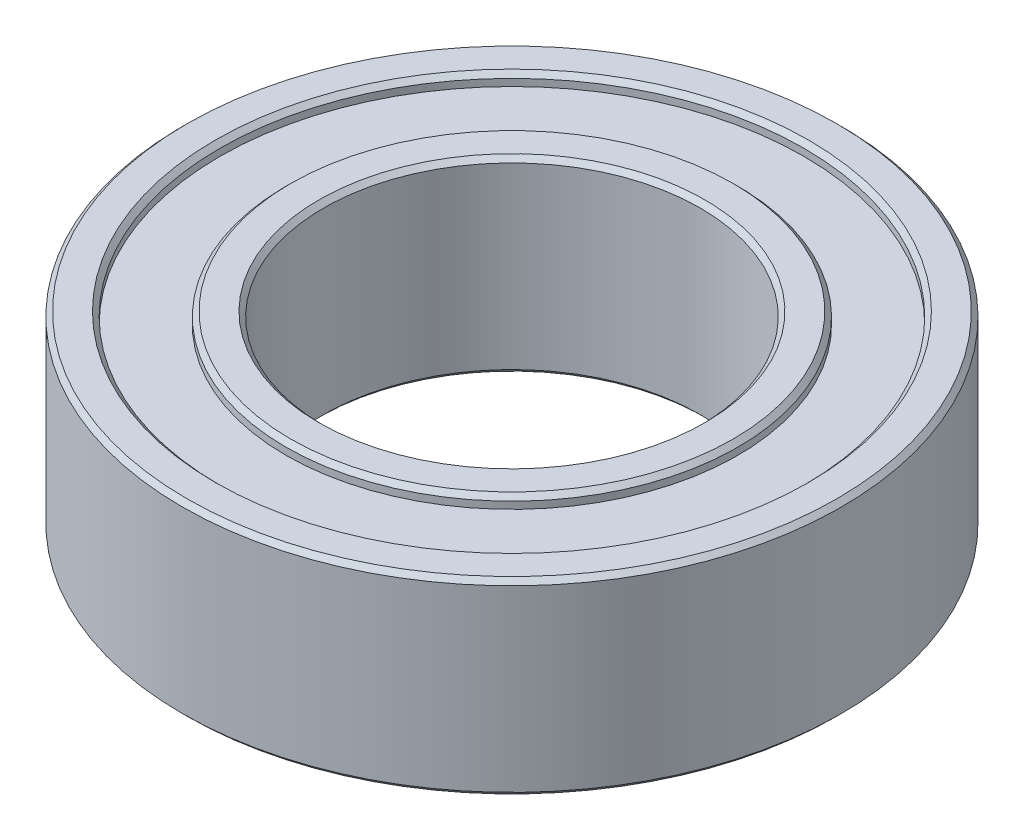
ISO-10303-21;
HEADER;
FILE_DESCRIPTION(('STEP AP214'),'2;1');
FILE_NAME('part.step','',(''),(''),'','','');
FILE_SCHEMA(('AUTOMOTIVE_DESIGN { 1 0 10303 214 1 1 1 1 }'));
ENDSEC;
DATA;
#1=APPLICATION_CONTEXT('core data for automotive mechanical design processes');
#2=APPLICATION_PROTOCOL_DEFINITION('international standard','automotive_design',2000,#1);
#3=PRODUCT_CONTEXT('',#1,'mechanical');
#4=PRODUCT('Part','Part','',(#3));
#5=PRODUCT_RELATED_PRODUCT_CATEGORY('part','',(#4));
#6=PRODUCT_DEFINITION_FORMATION('','',#4);
#7=PRODUCT_DEFINITION_CONTEXT('part definition',#1,'design');
#8=PRODUCT_DEFINITION('design','',#6,#7);
#9=PRODUCT_DEFINITION_SHAPE('','',#8);
#10=(LENGTH_UNIT() NAMED_UNIT(*) SI_UNIT(.MILLI.,.METRE.));
#11=(NAMED_UNIT(*) PLANE_ANGLE_UNIT() SI_UNIT($,.RADIAN.));
#12=(NAMED_UNIT(*) SI_UNIT($,.STERADIAN.) SOLID_ANGLE_UNIT());
#13=UNCERTAINTY_MEASURE_WITH_UNIT(LENGTH_MEASURE(1.E-05),#10,'distance_accuracy_value','');
#14=(GEOMETRIC_REPRESENTATION_CONTEXT(3) GLOBAL_UNCERTAINTY_ASSIGNED_CONTEXT((#13)) GLOBAL_UNIT_ASSIGNED_CONTEXT((#10,
#11,#12)) REPRESENTATION_CONTEXT('',''));
#15=CARTESIAN_POINT('',(0.,0.,0.));
#16=DIRECTION('',(0.,0.,1.));
#17=DIRECTION('',(1.,0.,0.));
#18=AXIS2_PLACEMENT_3D('',#15,#16,#17);
#19=CARTESIAN_POINT('',(0.,2.,0.));
#20=DIRECTION('',(0.,-1.,0.));
#21=DIRECTION('',(0.,0.,-1.));
#22=AXIS2_PLACEMENT_3D('',#19,#20,#21);
#23=CYLINDRICAL_SURFACE('',#22,4.8);
#24=CARTESIAN_POINT('',(0.,-1.9,0.));
#25=DIRECTION('',(0.,1.,0.));
#26=DIRECTION('',(0.,0.,1.));
#27=AXIS2_PLACEMENT_3D('',#24,#25,#26);
#28=CIRCLE('',#27,4.8);
#29=CARTESIAN_POINT('',(0.,-1.9,4.8));
#30=VERTEX_POINT('',#29);
#31=EDGE_CURVE('E86',#30,#30,#28,.T.);
#32=ORIENTED_EDGE('',*,*,#31,.T.);
#33=EDGE_LOOP('',(#32));
#34=FACE_BOUND('',#33,.T.);
#35=CARTESIAN_POINT('',(0.,-1.75,0.));
#36=DIRECTION('',(0.,1.,0.));
#37=DIRECTION('',(0.,0.,1.));
#38=AXIS2_PLACEMENT_3D('',#35,#36,#37);
#39=CIRCLE('',#38,4.8);
#40=CARTESIAN_POINT('',(0.,-1.75,4.8));
#41=VERTEX_POINT('',#40);
#42=EDGE_CURVE('E89',#41,#41,#39,.T.);
#43=ORIENTED_EDGE('',*,*,#42,.F.);
#44=EDGE_LOOP('',(#43));
#45=FACE_BOUND('',#44,.T.);
#46=ADVANCED_FACE('F57',(#34,#45),#23,.T.);
#47=CARTESIAN_POINT('',(0.,2.,0.));
#48=DIRECTION('',(0.,-1.,0.));
#49=DIRECTION('',(0.,0.,-1.));
#50=AXIS2_PLACEMENT_3D('',#47,#48,#49);
#51=CYLINDRICAL_SURFACE('',#50,4.);
#52=CARTESIAN_POINT('',(0.,-1.9,0.));
#53=DIRECTION('',(0.,1.,0.));
#54=DIRECTION('',(0.,0.,1.));
#55=AXIS2_PLACEMENT_3D('',#52,#53,#54);
#56=CIRCLE('',#55,4.);
#57=CARTESIAN_POINT('',(0.,-1.9,4.));
#58=VERTEX_POINT('',#57);
#59=EDGE_CURVE('E72',#58,#58,#56,.F.);
#60=ORIENTED_EDGE('',*,*,#59,.T.);
#61=EDGE_LOOP('',(#60));
#62=FACE_BOUND('',#61,.T.);
#63=CARTESIAN_POINT('',(0.,1.9,0.));
#64=DIRECTION('',(0.,1.,0.));
#65=DIRECTION('',(0.,0.,1.));
#66=AXIS2_PLACEMENT_3D('',#63,#64,#65);
#67=CIRCLE('',#66,4.);
#68=CARTESIAN_POINT('',(0.,1.9,4.));
#69=VERTEX_POINT('',#68);
#70=EDGE_CURVE('E77',#69,#69,#67,.T.);
#71=ORIENTED_EDGE('',*,*,#70,.T.);
#72=EDGE_LOOP('',(#71));
#73=FACE_BOUND('',#72,.T.);
#74=ADVANCED_FACE('F129',(#62,#73),#51,.F.);
#75=CARTESIAN_POINT('',(0.,1.9,0.));
#76=DIRECTION('',(0.,1.,0.));
#77=DIRECTION('',(0.,0.,1.));
#78=AXIS2_PLACEMENT_3D('',#75,#76,#77);
#79=CIRCLE('',#78,4.8);
#80=CARTESIAN_POINT('',(0.,1.9,4.8));
#81=VERTEX_POINT('',#80);
#82=EDGE_CURVE('E12',#81,#81,#79,.F.);
#83=ORIENTED_EDGE('',*,*,#82,.T.);
#84=EDGE_LOOP('',(#83));
#85=FACE_BOUND('',#84,.T.);
#86=CARTESIAN_POINT('',(0.,1.75,0.));
#87=DIRECTION('',(0.,1.,0.));
#88=DIRECTION('',(0.,0.,1.));
#89=AXIS2_PLACEMENT_3D('',#86,#87,#88);
#90=CIRCLE('',#89,4.8);
#91=CARTESIAN_POINT('',(0.,1.75,4.8));
#92=VERTEX_POINT('',#91);
#93=EDGE_CURVE('E96',#92,#92,#90,.T.);
#94=ORIENTED_EDGE('',*,*,#93,.T.);
#95=EDGE_LOOP('',(#94));
#96=FACE_BOUND('',#95,.T.);
#97=ADVANCED_FACE('F102',(#85,#96),#23,.T.);
#98=CARTESIAN_POINT('',(0.,2.,0.));
#99=DIRECTION('',(0.,1.,0.));
#100=DIRECTION('',(0.,0.,1.));
#101=AXIS2_PLACEMENT_3D('',#98,#99,#100);
#102=PLANE('',#101);
#103=CARTESIAN_POINT('',(0.,2.,0.));
#104=DIRECTION('',(0.,1.,0.));
#105=DIRECTION('',(0.,0.,1.));
#106=AXIS2_PLACEMENT_3D('',#103,#104,#105);
#107=CIRCLE('',#106,4.7);
#108=CARTESIAN_POINT('',(0.,2.,4.7));
#109=VERTEX_POINT('',#108);
#110=EDGE_CURVE('E64',#109,#109,#107,.T.);
#111=ORIENTED_EDGE('',*,*,#110,.T.);
#112=EDGE_LOOP('',(#111));
#113=FACE_BOUND('',#112,.T.);
#114=CARTESIAN_POINT('',(0.,2.,0.));
#115=DIRECTION('',(0.,1.,0.));
#116=DIRECTION('',(0.,0.,1.));
#117=AXIS2_PLACEMENT_3D('',#114,#115,#116);
#118=CIRCLE('',#117,4.1);
#119=CARTESIAN_POINT('',(0.,2.,4.1));
#120=VERTEX_POINT('',#119);
#121=EDGE_CURVE('E68',#120,#120,#118,.F.);
#122=ORIENTED_EDGE('',*,*,#121,.T.);
#123=EDGE_LOOP('',(#122));
#124=FACE_BOUND('',#123,.T.);
#125=ADVANCED_FACE('F141',(#113,#124),#102,.T.);
#126=CARTESIAN_POINT('',(0.,-2.,0.));
#127=DIRECTION('',(0.,1.,0.));
#128=DIRECTION('',(0.,0.,1.));
#129=AXIS2_PLACEMENT_3D('',#126,#127,#128);
#130=PLANE('',#129);
#131=CARTESIAN_POINT('',(0.,-2.,0.));
#132=DIRECTION('',(0.,1.,0.));
#133=DIRECTION('',(0.,0.,1.));
#134=AXIS2_PLACEMENT_3D('',#131,#132,#133);
#135=CIRCLE('',#134,4.7);
#136=CARTESIAN_POINT('',(0.,-2.,4.7));
#137=VERTEX_POINT('',#136);
#138=EDGE_CURVE('E80',#137,#137,#135,.F.);
#139=ORIENTED_EDGE('',*,*,#138,.T.);
#140=EDGE_LOOP('',(#139));
#141=FACE_BOUND('',#140,.T.);
#142=CARTESIAN_POINT('',(0.,-2.,0.));
#143=DIRECTION('',(0.,1.,0.));
#144=DIRECTION('',(0.,0.,1.));
#145=AXIS2_PLACEMENT_3D('',#142,#143,#144);
#146=CIRCLE('',#145,4.1);
#147=CARTESIAN_POINT('',(0.,-2.,4.1));
#148=VERTEX_POINT('',#147);
#149=EDGE_CURVE('E83',#148,#148,#146,.T.);
#150=ORIENTED_EDGE('',*,*,#149,.T.);
#151=EDGE_LOOP('',(#150));
#152=FACE_BOUND('',#151,.T.);
#153=ADVANCED_FACE('F114',(#141,#152),#130,.F.);
#154=CARTESIAN_POINT('',(0.,1.75,0.));
#155=DIRECTION('',(0.,-1.,0.));
#156=DIRECTION('',(0.,0.,-1.));
#157=AXIS2_PLACEMENT_3D('',#154,#155,#156);
#158=CYLINDRICAL_SURFACE('',#157,6.2);
#159=CARTESIAN_POINT('',(0.,1.75,0.));
#160=DIRECTION('',(0.,1.,0.));
#161=DIRECTION('',(0.,0.,1.));
#162=AXIS2_PLACEMENT_3D('',#159,#160,#161);
#163=CIRCLE('',#162,6.2);
#164=CARTESIAN_POINT('',(0.,1.75,6.2));
#165=VERTEX_POINT('',#164);
#166=EDGE_CURVE('E92',#165,#165,#163,.T.);
#167=ORIENTED_EDGE('',*,*,#166,.F.);
#168=EDGE_LOOP('',(#167));
#169=FACE_BOUND('',#168,.T.);
#170=CARTESIAN_POINT('',(0.,-1.75,0.));
#171=DIRECTION('',(0.,1.,0.));
#172=DIRECTION('',(0.,0.,1.));
#173=AXIS2_PLACEMENT_3D('',#170,#171,#172);
#174=CIRCLE('',#173,6.2);
#175=CARTESIAN_POINT('',(0.,-1.75,6.2));
#176=VERTEX_POINT('',#175);
#177=EDGE_CURVE('E93',#176,#176,#174,.T.);
#178=ORIENTED_EDGE('',*,*,#177,.T.);
#179=EDGE_LOOP('',(#178));
#180=FACE_BOUND('',#179,.T.);
#181=ADVANCED_FACE('F108',(#169,#180),#158,.T.);
#182=CARTESIAN_POINT('',(0.,1.75,0.));
#183=DIRECTION('',(0.,1.,0.));
#184=DIRECTION('',(0.,0.,1.));
#185=AXIS2_PLACEMENT_3D('',#182,#183,#184);
#186=PLANE('',#185);
#187=ORIENTED_EDGE('',*,*,#93,.F.);
#188=EDGE_LOOP('',(#187));
#189=FACE_BOUND('',#188,.T.);
#190=ORIENTED_EDGE('',*,*,#166,.T.);
#191=EDGE_LOOP('',(#190));
#192=FACE_BOUND('',#191,.T.);
#193=ADVANCED_FACE('F104',(#189,#192),#186,.T.);
#194=CARTESIAN_POINT('',(0.,-1.75,0.));
#195=DIRECTION('',(0.,1.,0.));
#196=DIRECTION('',(0.,0.,1.));
#197=AXIS2_PLACEMENT_3D('',#194,#195,#196);
#198=PLANE('',#197);
#199=ORIENTED_EDGE('',*,*,#42,.T.);
#200=EDGE_LOOP('',(#199));
#201=FACE_BOUND('',#200,.T.);
#202=ORIENTED_EDGE('',*,*,#177,.F.);
#203=EDGE_LOOP('',(#202));
#204=FACE_BOUND('',#203,.T.);
#205=ADVANCED_FACE('F107',(#201,#204),#198,.F.);
#206=CARTESIAN_POINT('',(0.,-1.9,0.));
#207=DIRECTION('',(0.,1.,0.));
#208=DIRECTION('',(0.,0.,1.));
#209=AXIS2_PLACEMENT_3D('',#206,#207,#208);
#210=CONICAL_SURFACE('',#209,4.8,0.785398163397453);
#211=ORIENTED_EDGE('',*,*,#138,.F.);
#212=EDGE_LOOP('',(#211));
#213=FACE_BOUND('',#212,.T.);
#214=ORIENTED_EDGE('',*,*,#31,.F.);
#215=EDGE_LOOP('',(#214));
#216=FACE_BOUND('',#215,.T.);
#217=ADVANCED_FACE('F119',(#213,#216),#210,.T.);
#218=CARTESIAN_POINT('',(0.,-2.,0.));
#219=DIRECTION('',(0.,-1.,0.));
#220=DIRECTION('',(0.,0.,-1.));
#221=AXIS2_PLACEMENT_3D('',#218,#219,#220);
#222=CONICAL_SURFACE('',#221,4.1,0.785398163397457);
#223=ORIENTED_EDGE('',*,*,#59,.F.);
#224=EDGE_LOOP('',(#223));
#225=FACE_BOUND('',#224,.T.);
#226=ORIENTED_EDGE('',*,*,#149,.F.);
#227=EDGE_LOOP('',(#226));
#228=FACE_BOUND('',#227,.T.);
#229=ADVANCED_FACE('F125',(#225,#228),#222,.F.);
#230=CARTESIAN_POINT('',(0.,2.,0.));
#231=DIRECTION('',(0.,-1.,0.));
#232=DIRECTION('',(0.,0.,-1.));
#233=AXIS2_PLACEMENT_3D('',#230,#231,#232);
#234=CONICAL_SURFACE('',#233,4.7,0.785398163397461);
#235=ORIENTED_EDGE('',*,*,#82,.F.);
#236=EDGE_LOOP('',(#235));
#237=FACE_BOUND('',#236,.T.);
#238=ORIENTED_EDGE('',*,*,#110,.F.);
#239=EDGE_LOOP('',(#238));
#240=FACE_BOUND('',#239,.T.);
#241=ADVANCED_FACE('F155',(#237,#240),#234,.T.);
#242=CARTESIAN_POINT('',(0.,1.9,0.));
#243=DIRECTION('',(0.,1.,0.));
#244=DIRECTION('',(0.,0.,1.));
#245=AXIS2_PLACEMENT_3D('',#242,#243,#244);
#246=CONICAL_SURFACE('',#245,4.,0.785398163397435);
#247=ORIENTED_EDGE('',*,*,#121,.F.);
#248=EDGE_LOOP('',(#247));
#249=FACE_BOUND('',#248,.T.);
#250=ORIENTED_EDGE('',*,*,#70,.F.);
#251=EDGE_LOOP('',(#250));
#252=FACE_BOUND('',#251,.T.);
#253=ADVANCED_FACE('F59',(#249,#252),#246,.F.);
#254=CLOSED_SHELL('',(#46,#74,#97,#125,#153,#181,#193,#205,#217,#229,#241,#253));
#255=MANIFOLD_SOLID_BREP('B2',#254);
#256=CARTESIAN_POINT('',(0.,2.,0.));
#257=DIRECTION('',(0.,-1.,0.));
#258=DIRECTION('',(0.,0.,-1.));
#259=AXIS2_PLACEMENT_3D('',#256,#257,#258);
#260=CYLINDRICAL_SURFACE('',#259,6.2);
#261=CARTESIAN_POINT('',(0.,1.9,0.));
#262=DIRECTION('',(0.,1.,0.));
#263=DIRECTION('',(0.,0.,1.));
#264=AXIS2_PLACEMENT_3D('',#261,#262,#263);
#265=CIRCLE('',#264,6.2);
#266=CARTESIAN_POINT('',(0.,1.9,6.2));
#267=VERTEX_POINT('',#266);
#268=EDGE_CURVE('E252',#267,#267,#265,.T.);
#269=ORIENTED_EDGE('',*,*,#268,.T.);
#270=EDGE_LOOP('',(#269));
#271=FACE_BOUND('',#270,.T.);
#272=CARTESIAN_POINT('',(0.,-1.9,0.));
#273=DIRECTION('',(0.,1.,0.));
#274=DIRECTION('',(0.,0.,1.));
#275=AXIS2_PLACEMENT_3D('',#272,#273,#274);
#276=CIRCLE('',#275,6.2);
#277=CARTESIAN_POINT('',(0.,-1.9,6.2));
#278=VERTEX_POINT('',#277);
#279=EDGE_CURVE('E255',#278,#278,#276,.F.);
#280=ORIENTED_EDGE('',*,*,#279,.T.);
#281=EDGE_LOOP('',(#280));
#282=FACE_BOUND('',#281,.T.);
#283=ADVANCED_FACE('F226',(#271,#282),#260,.F.);
#284=CARTESIAN_POINT('',(0.,2.,0.));
#285=DIRECTION('',(0.,-1.,0.));
#286=DIRECTION('',(0.,0.,-1.));
#287=AXIS2_PLACEMENT_3D('',#284,#285,#286);
#288=CYLINDRICAL_SURFACE('',#287,7.);
#289=CARTESIAN_POINT('',(0.,1.9,0.));
#290=DIRECTION('',(0.,1.,0.));
#291=DIRECTION('',(0.,0.,1.));
#292=AXIS2_PLACEMENT_3D('',#289,#290,#291);
#293=CIRCLE('',#292,7.);
#294=CARTESIAN_POINT('',(0.,1.9,7.));
#295=VERTEX_POINT('',#294);
#296=EDGE_CURVE('E237',#295,#295,#293,.F.);
#297=ORIENTED_EDGE('',*,*,#296,.T.);
#298=EDGE_LOOP('',(#297));
#299=FACE_BOUND('',#298,.T.);
#300=CARTESIAN_POINT('',(0.,-1.9,0.));
#301=DIRECTION('',(0.,1.,0.));
#302=DIRECTION('',(0.,0.,1.));
#303=AXIS2_PLACEMENT_3D('',#300,#301,#302);
#304=CIRCLE('',#303,7.);
#305=CARTESIAN_POINT('',(0.,-1.9,7.));
#306=VERTEX_POINT('',#305);
#307=EDGE_CURVE('E241',#306,#306,#304,.T.);
#308=ORIENTED_EDGE('',*,*,#307,.T.);
#309=EDGE_LOOP('',(#308));
#310=FACE_BOUND('',#309,.T.);
#311=ADVANCED_FACE('F273',(#299,#310),#288,.T.);
#312=CARTESIAN_POINT('',(0.,2.,0.));
#313=DIRECTION('',(0.,1.,0.));
#314=DIRECTION('',(0.,0.,1.));
#315=AXIS2_PLACEMENT_3D('',#312,#313,#314);
#316=PLANE('',#315);
#317=CARTESIAN_POINT('',(0.,2.,0.));
#318=DIRECTION('',(0.,1.,0.));
#319=DIRECTION('',(0.,0.,1.));
#320=AXIS2_PLACEMENT_3D('',#317,#318,#319);
#321=CIRCLE('',#320,6.3);
#322=CARTESIAN_POINT('',(0.,2.,6.3));
#323=VERTEX_POINT('',#322);
#324=EDGE_CURVE('E246',#323,#323,#321,.F.);
#325=ORIENTED_EDGE('',*,*,#324,.T.);
#326=EDGE_LOOP('',(#325));
#327=FACE_BOUND('',#326,.T.);
#328=CARTESIAN_POINT('',(0.,2.,0.));
#329=DIRECTION('',(0.,1.,0.));
#330=DIRECTION('',(0.,0.,1.));
#331=AXIS2_PLACEMENT_3D('',#328,#329,#330);
#332=CIRCLE('',#331,6.9);
#333=CARTESIAN_POINT('',(0.,2.,6.9));
#334=VERTEX_POINT('',#333);
#335=EDGE_CURVE('E249',#334,#334,#332,.T.);
#336=ORIENTED_EDGE('',*,*,#335,.T.);
#337=EDGE_LOOP('',(#336));
#338=FACE_BOUND('',#337,.T.);
#339=ADVANCED_FACE('F279',(#327,#338),#316,.T.);
#340=CARTESIAN_POINT('',(0.,-2.,0.));
#341=DIRECTION('',(0.,1.,0.));
#342=DIRECTION('',(0.,0.,1.));
#343=AXIS2_PLACEMENT_3D('',#340,#341,#342);
#344=PLANE('',#343);
#345=CARTESIAN_POINT('',(0.,-2.,0.));
#346=DIRECTION('',(0.,1.,0.));
#347=DIRECTION('',(0.,0.,1.));
#348=AXIS2_PLACEMENT_3D('',#345,#346,#347);
#349=CIRCLE('',#348,6.3);
#350=CARTESIAN_POINT('',(0.,-2.,6.3));
#351=VERTEX_POINT('',#350);
#352=EDGE_CURVE('E56',#351,#351,#349,.T.);
#353=ORIENTED_EDGE('',*,*,#352,.T.);
#354=EDGE_LOOP('',(#353));
#355=FACE_BOUND('',#354,.T.);
#356=CARTESIAN_POINT('',(0.,-2.,0.));
#357=DIRECTION('',(0.,1.,0.));
#358=DIRECTION('',(0.,0.,1.));
#359=AXIS2_PLACEMENT_3D('',#356,#357,#358);
#360=CIRCLE('',#359,6.9);
#361=CARTESIAN_POINT('',(0.,-2.,6.9));
#362=VERTEX_POINT('',#361);
#363=EDGE_CURVE('E233',#362,#362,#360,.F.);
#364=ORIENTED_EDGE('',*,*,#363,.T.);
#365=EDGE_LOOP('',(#364));
#366=FACE_BOUND('',#365,.T.);
#367=ADVANCED_FACE('F285',(#355,#366),#344,.F.);
#368=CARTESIAN_POINT('',(0.,1.9,0.));
#369=DIRECTION('',(0.,1.,0.));
#370=DIRECTION('',(0.,0.,1.));
#371=AXIS2_PLACEMENT_3D('',#368,#369,#370);
#372=CONICAL_SURFACE('',#371,6.2,0.785398163397444);
#373=ORIENTED_EDGE('',*,*,#324,.F.);
#374=EDGE_LOOP('',(#373));
#375=FACE_BOUND('',#374,.T.);
#376=ORIENTED_EDGE('',*,*,#268,.F.);
#377=EDGE_LOOP('',(#376));
#378=FACE_BOUND('',#377,.T.);
#379=ADVANCED_FACE('F269',(#375,#378),#372,.F.);
#380=CARTESIAN_POINT('',(0.,2.,0.));
#381=DIRECTION('',(0.,-1.,0.));
#382=DIRECTION('',(0.,0.,-1.));
#383=AXIS2_PLACEMENT_3D('',#380,#381,#382);
#384=CONICAL_SURFACE('',#383,6.9,0.785398163397457);
#385=ORIENTED_EDGE('',*,*,#296,.F.);
#386=EDGE_LOOP('',(#385));
#387=FACE_BOUND('',#386,.T.);
#388=ORIENTED_EDGE('',*,*,#335,.F.);
#389=EDGE_LOOP('',(#388));
#390=FACE_BOUND('',#389,.T.);
#391=ADVANCED_FACE('F263',(#387,#390),#384,.T.);
#392=CARTESIAN_POINT('',(0.,-2.,0.));
#393=DIRECTION('',(0.,-1.,0.));
#394=DIRECTION('',(0.,0.,-1.));
#395=AXIS2_PLACEMENT_3D('',#392,#393,#394);
#396=CONICAL_SURFACE('',#395,6.3,0.785398163397453);
#397=ORIENTED_EDGE('',*,*,#279,.F.);
#398=EDGE_LOOP('',(#397));
#399=FACE_BOUND('',#398,.T.);
#400=ORIENTED_EDGE('',*,*,#352,.F.);
#401=EDGE_LOOP('',(#400));
#402=FACE_BOUND('',#401,.T.);
#403=ADVANCED_FACE('F260',(#399,#402),#396,.F.);
#404=CARTESIAN_POINT('',(0.,-1.9,0.));
#405=DIRECTION('',(0.,1.,0.));
#406=DIRECTION('',(0.,0.,1.));
#407=AXIS2_PLACEMENT_3D('',#404,#405,#406);
#408=CONICAL_SURFACE('',#407,7.,0.785398163397444);
#409=ORIENTED_EDGE('',*,*,#363,.F.);
#410=EDGE_LOOP('',(#409));
#411=FACE_BOUND('',#410,.T.);
#412=ORIENTED_EDGE('',*,*,#307,.F.);
#413=EDGE_LOOP('',(#412));
#414=FACE_BOUND('',#413,.T.);
#415=ADVANCED_FACE('F228',(#411,#414),#408,.T.);
#416=CLOSED_SHELL('',(#283,#311,#339,#367,#379,#391,#403,#415));
#417=MANIFOLD_SOLID_BREP('B7',#416);
#418=ADVANCED_BREP_SHAPE_REPRESENTATION('',(#18,#255,#417),#14);
#419=SHAPE_DEFINITION_REPRESENTATION(#9,#418);
ENDSEC;
END-ISO-10303-21;
